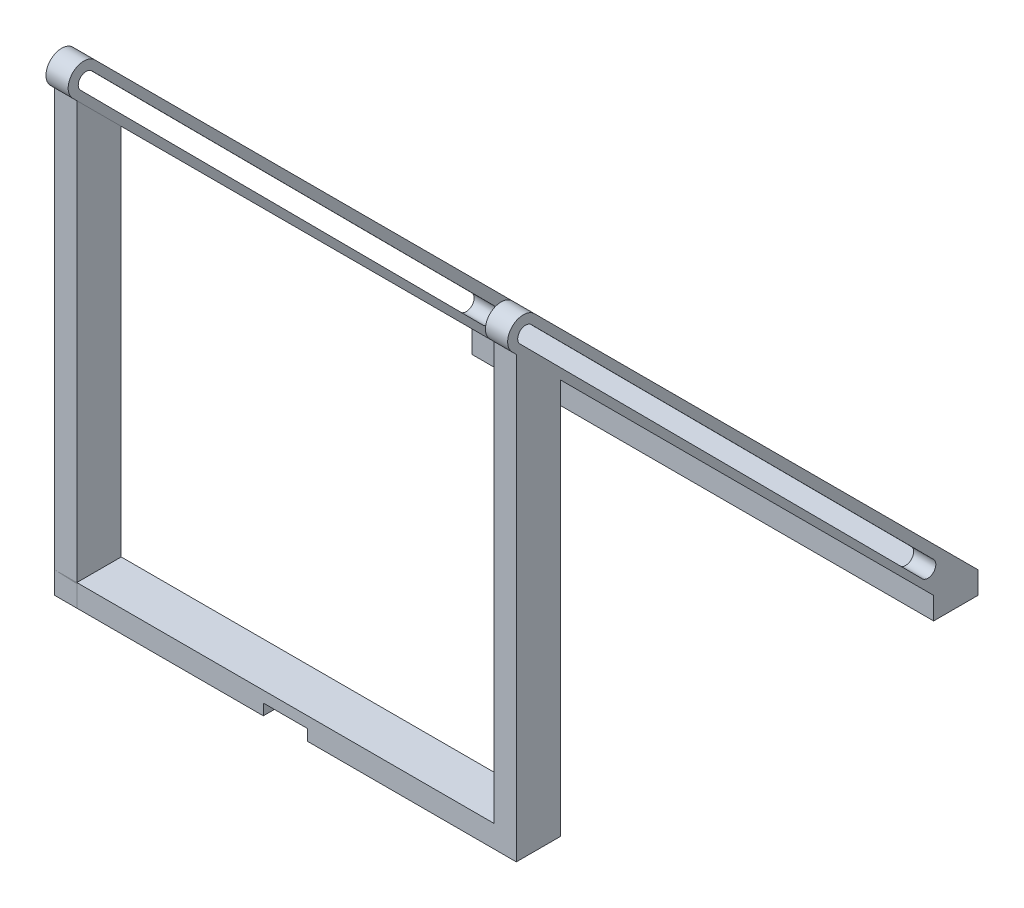
ISO-10303-21;
HEADER;
FILE_DESCRIPTION(('STEP AP214'),'2;1');
FILE_NAME('part.step','',(''),(''),'','','');
FILE_SCHEMA(('AUTOMOTIVE_DESIGN { 1 0 10303 214 1 1 1 1 }'));
ENDSEC;
DATA;
#1=APPLICATION_CONTEXT('core data for automotive mechanical design processes');
#2=APPLICATION_PROTOCOL_DEFINITION('international standard','automotive_design',2000,#1);
#3=PRODUCT_CONTEXT('',#1,'mechanical');
#4=PRODUCT('Part','Part','',(#3));
#5=PRODUCT_RELATED_PRODUCT_CATEGORY('part','',(#4));
#6=PRODUCT_DEFINITION_FORMATION('','',#4);
#7=PRODUCT_DEFINITION_CONTEXT('part definition',#1,'design');
#8=PRODUCT_DEFINITION('design','',#6,#7);
#9=PRODUCT_DEFINITION_SHAPE('','',#8);
#10=(LENGTH_UNIT() NAMED_UNIT(*) SI_UNIT(.MILLI.,.METRE.));
#11=(NAMED_UNIT(*) PLANE_ANGLE_UNIT() SI_UNIT($,.RADIAN.));
#12=(NAMED_UNIT(*) SI_UNIT($,.STERADIAN.) SOLID_ANGLE_UNIT());
#13=UNCERTAINTY_MEASURE_WITH_UNIT(LENGTH_MEASURE(1.E-05),#10,'distance_accuracy_value','');
#14=(GEOMETRIC_REPRESENTATION_CONTEXT(3) GLOBAL_UNCERTAINTY_ASSIGNED_CONTEXT((#13)) GLOBAL_UNIT_ASSIGNED_CONTEXT((#10,
#11,#12)) REPRESENTATION_CONTEXT('',''));
#15=CARTESIAN_POINT('',(0.,0.,0.));
#16=DIRECTION('',(0.,0.,1.));
#17=DIRECTION('',(1.,0.,0.));
#18=AXIS2_PLACEMENT_3D('',#15,#16,#17);
#19=CARTESIAN_POINT('',(-462.534,0.,462.534));
#20=DIRECTION('',(-1.,0.,0.));
#21=DIRECTION('',(0.,0.,1.));
#22=AXIS2_PLACEMENT_3D('',#19,#20,#21);
#23=PLANE('',#22);
#24=DIRECTION('',(0.,1.,0.));
#25=VECTOR('',#24,1.);
#26=CARTESIAN_POINT('',(-462.534,0.,462.534));
#27=LINE('',#26,#25);
#28=CARTESIAN_POINT('',(-462.534,0.,462.534));
#29=VERTEX_POINT('',#28);
#30=CARTESIAN_POINT('',(-462.534,880.618000000003,462.534));
#31=VERTEX_POINT('',#30);
#32=EDGE_CURVE('E49',#29,#31,#27,.T.);
#33=ORIENTED_EDGE('',*,*,#32,.T.);
#34=DIRECTION('',(0.,-0.707106781186549,-0.707106781186546));
#35=VECTOR('',#34,1.);
#36=CARTESIAN_POINT('',(-462.534,918.382115898591,500.298115898588));
#37=LINE('',#36,#35);
#38=CARTESIAN_POINT('',(-462.534,791.718000000003,373.634));
#39=VERTEX_POINT('',#38);
#40=EDGE_CURVE('E107',#31,#39,#37,.T.);
#41=ORIENTED_EDGE('',*,*,#40,.T.);
#42=DIRECTION('',(0.,1.,0.));
#43=VECTOR('',#42,1.);
#44=CARTESIAN_POINT('',(-462.534,0.,373.634));
#45=LINE('',#44,#43);
#46=CARTESIAN_POINT('',(-462.534,0.,373.634));
#47=VERTEX_POINT('',#46);
#48=EDGE_CURVE('E12',#47,#39,#45,.T.);
#49=ORIENTED_EDGE('',*,*,#48,.F.);
#50=DIRECTION('',(0.,0.,1.));
#51=VECTOR('',#50,1.);
#52=CARTESIAN_POINT('',(-462.534,0.,462.534));
#53=LINE('',#52,#51);
#54=EDGE_CURVE('E109',#47,#29,#53,.T.);
#55=ORIENTED_EDGE('',*,*,#54,.T.);
#56=EDGE_LOOP('',(#33,#41,#49,#55));
#57=FACE_BOUND('',#56,.T.);
#58=ADVANCED_FACE('F46',(#57),#23,.T.);
#59=CARTESIAN_POINT('',(-462.534,0.,373.634));
#60=DIRECTION('',(0.,0.,-1.));
#61=DIRECTION('',(-1.,0.,0.));
#62=AXIS2_PLACEMENT_3D('',#59,#60,#61);
#63=PLANE('',#62);
#64=ORIENTED_EDGE('',*,*,#48,.T.);
#65=DIRECTION('',(1.,0.,0.));
#66=VECTOR('',#65,1.);
#67=CARTESIAN_POINT('',(-462.534,791.718000000003,373.634));
#68=LINE('',#67,#66);
#69=CARTESIAN_POINT('',(-418.084,791.718000000003,373.634));
#70=VERTEX_POINT('',#69);
#71=EDGE_CURVE('E99',#39,#70,#68,.T.);
#72=ORIENTED_EDGE('',*,*,#71,.T.);
#73=DIRECTION('',(0.,1.,0.));
#74=VECTOR('',#73,1.);
#75=CARTESIAN_POINT('',(-418.084,0.,373.634));
#76=LINE('',#75,#74);
#77=CARTESIAN_POINT('',(-418.084,0.,373.634));
#78=VERTEX_POINT('',#77);
#79=EDGE_CURVE('E54',#78,#70,#76,.T.);
#80=ORIENTED_EDGE('',*,*,#79,.F.);
#81=DIRECTION('',(-1.,0.,0.));
#82=VECTOR('',#81,1.);
#83=CARTESIAN_POINT('',(-462.534,0.,373.634));
#84=LINE('',#83,#82);
#85=EDGE_CURVE('E115',#78,#47,#84,.T.);
#86=ORIENTED_EDGE('',*,*,#85,.T.);
#87=EDGE_LOOP('',(#64,#72,#80,#86));
#88=FACE_BOUND('',#87,.T.);
#89=ADVANCED_FACE('F103',(#88),#63,.T.);
#90=CARTESIAN_POINT('',(-418.084,0.,462.534));
#91=DIRECTION('',(1.,0.,0.));
#92=DIRECTION('',(0.,0.,-1.));
#93=AXIS2_PLACEMENT_3D('',#90,#91,#92);
#94=PLANE('',#93);
#95=ORIENTED_EDGE('',*,*,#79,.T.);
#96=DIRECTION('',(0.,0.707106781186549,0.707106781186546));
#97=VECTOR('',#96,1.);
#98=CARTESIAN_POINT('',(-418.084,918.382115898591,500.298115898588));
#99=LINE('',#98,#97);
#100=CARTESIAN_POINT('',(-418.084,880.618000000003,462.534));
#101=VERTEX_POINT('',#100);
#102=EDGE_CURVE('E88',#70,#101,#99,.T.);
#103=ORIENTED_EDGE('',*,*,#102,.T.);
#104=DIRECTION('',(0.,1.,0.));
#105=VECTOR('',#104,1.);
#106=CARTESIAN_POINT('',(-418.084,0.,462.534));
#107=LINE('',#106,#105);
#108=CARTESIAN_POINT('',(-418.084,0.,462.534));
#109=VERTEX_POINT('',#108);
#110=EDGE_CURVE('E92',#109,#101,#107,.T.);
#111=ORIENTED_EDGE('',*,*,#110,.F.);
#112=DIRECTION('',(0.,0.,-1.));
#113=VECTOR('',#112,1.);
#114=CARTESIAN_POINT('',(-418.084,0.,462.534));
#115=LINE('',#114,#113);
#116=EDGE_CURVE('E90',#109,#78,#115,.T.);
#117=ORIENTED_EDGE('',*,*,#116,.T.);
#118=EDGE_LOOP('',(#95,#103,#111,#117));
#119=FACE_BOUND('',#118,.T.);
#120=ADVANCED_FACE('F87',(#119),#94,.T.);
#121=CARTESIAN_POINT('',(-462.534,0.,462.534));
#122=DIRECTION('',(0.,0.,1.));
#123=DIRECTION('',(1.,0.,0.));
#124=AXIS2_PLACEMENT_3D('',#121,#122,#123);
#125=PLANE('',#124);
#126=ORIENTED_EDGE('',*,*,#110,.T.);
#127=DIRECTION('',(-1.,0.,0.));
#128=VECTOR('',#127,1.);
#129=CARTESIAN_POINT('',(-462.534,880.618000000003,462.534));
#130=LINE('',#129,#128);
#131=EDGE_CURVE('E101',#101,#31,#130,.T.);
#132=ORIENTED_EDGE('',*,*,#131,.T.);
#133=ORIENTED_EDGE('',*,*,#32,.F.);
#134=DIRECTION('',(1.,0.,0.));
#135=VECTOR('',#134,1.);
#136=CARTESIAN_POINT('',(-462.534,0.,462.534));
#137=LINE('',#136,#135);
#138=EDGE_CURVE('E111',#29,#109,#137,.T.);
#139=ORIENTED_EDGE('',*,*,#138,.T.);
#140=EDGE_LOOP('',(#126,#132,#133,#139));
#141=FACE_BOUND('',#140,.T.);
#142=ADVANCED_FACE('F118',(#141),#125,.T.);
#143=CARTESIAN_POINT('',(0.,0.,0.));
#144=DIRECTION('',(0.,-1.,0.));
#145=DIRECTION('',(0.,0.,-1.));
#146=AXIS2_PLACEMENT_3D('',#143,#144,#145);
#147=PLANE('',#146);
#148=ORIENTED_EDGE('',*,*,#54,.F.);
#149=ORIENTED_EDGE('',*,*,#85,.F.);
#150=ORIENTED_EDGE('',*,*,#116,.F.);
#151=ORIENTED_EDGE('',*,*,#138,.F.);
#152=EDGE_LOOP('',(#148,#149,#150,#151));
#153=FACE_BOUND('',#152,.T.);
#154=ADVANCED_FACE('F120',(#153),#147,.T.);
#155=CARTESIAN_POINT('',(-462.534,44.45,-373.634));
#156=DIRECTION('',(0.,-0.707106781186546,0.707106781186549));
#157=DIRECTION('',(0.,-0.707106781186549,-0.707106781186546));
#158=AXIS2_PLACEMENT_3D('',#155,#156,#157);
#159=PLANE('',#158);
#160=ORIENTED_EDGE('',*,*,#131,.F.);
#161=ORIENTED_EDGE('',*,*,#102,.F.);
#162=ORIENTED_EDGE('',*,*,#71,.F.);
#163=ORIENTED_EDGE('',*,*,#40,.F.);
#164=EDGE_LOOP('',(#160,#161,#162,#163));
#165=FACE_BOUND('',#164,.T.);
#166=ADVANCED_FACE('F97',(#165),#159,.F.);
#167=CLOSED_SHELL('',(#58,#89,#120,#142,#154,#166));
#168=MANIFOLD_SOLID_BREP('B2',#167);
#169=CARTESIAN_POINT('',(-418.084,911.044715683175,448.510715683172));
#170=DIRECTION('',(1.,0.,0.));
#171=DIRECTION('',(0.,0.,-1.));
#172=AXIS2_PLACEMENT_3D('',#169,#170,#171);
#173=CYLINDRICAL_SURFACE('',#172,31.4308964237421);
#174=DIRECTION('',(1.,0.,0.));
#175=VECTOR('',#174,1.);
#176=CARTESIAN_POINT('',(-462.534,888.819715683175,470.735715683172));
#177=LINE('',#176,#175);
#178=CARTESIAN_POINT('',(-418.084,888.819715683175,470.735715683172));
#179=VERTEX_POINT('',#178);
#180=CARTESIAN_POINT('',(-462.534,888.819715683175,470.735715683172));
#181=VERTEX_POINT('',#180);
#182=EDGE_CURVE('E301',#179,#181,#177,.F.);
#183=ORIENTED_EDGE('',*,*,#182,.F.);
#184=CARTESIAN_POINT('',(-418.084,911.044715683175,448.510715683172));
#185=DIRECTION('',(1.,0.,0.));
#186=DIRECTION('',(0.,0.,-1.));
#187=AXIS2_PLACEMENT_3D('',#184,#185,#186);
#188=CIRCLE('',#187,31.4308964237421);
#189=CARTESIAN_POINT('',(-418.084,933.269715683175,426.285715683172));
#190=VERTEX_POINT('',#189);
#191=EDGE_CURVE('E187',#190,#179,#188,.T.);
#192=ORIENTED_EDGE('',*,*,#191,.F.);
#193=DIRECTION('',(1.,0.,0.));
#194=VECTOR('',#193,1.);
#195=CARTESIAN_POINT('',(-462.534,933.269715683175,426.285715683172));
#196=LINE('',#195,#194);
#197=CARTESIAN_POINT('',(-462.534,933.269715683175,426.285715683172));
#198=VERTEX_POINT('',#197);
#199=EDGE_CURVE('E306',#198,#190,#196,.T.);
#200=ORIENTED_EDGE('',*,*,#199,.F.);
#201=CARTESIAN_POINT('',(-462.534,911.044715683175,448.510715683172));
#202=DIRECTION('',(-1.,0.,0.));
#203=DIRECTION('',(0.,0.,1.));
#204=AXIS2_PLACEMENT_3D('',#201,#202,#203);
#205=CIRCLE('',#204,31.4308964237421);
#206=EDGE_CURVE('E44',#181,#198,#205,.T.);
#207=ORIENTED_EDGE('',*,*,#206,.F.);
#208=EDGE_LOOP('',(#183,#192,#200,#207));
#209=FACE_BOUND('',#208,.T.);
#210=ADVANCED_FACE('F179',(#209),#173,.T.);
#211=CARTESIAN_POINT('',(0.,44.45,0.));
#212=DIRECTION('',(0.,1.,0.));
#213=DIRECTION('',(0.,0.,1.));
#214=AXIS2_PLACEMENT_3D('',#211,#212,#213);
#215=PLANE('',#214);
#216=DIRECTION('',(0.,0.,1.));
#217=VECTOR('',#216,1.);
#218=CARTESIAN_POINT('',(-462.534,44.45,-462.534));
#219=LINE('',#218,#217);
#220=CARTESIAN_POINT('',(-462.534,44.45,-462.534));
#221=VERTEX_POINT('',#220);
#222=CARTESIAN_POINT('',(-462.534,44.45,-373.634));
#223=VERTEX_POINT('',#222);
#224=EDGE_CURVE('E276',#221,#223,#219,.T.);
#225=ORIENTED_EDGE('',*,*,#224,.F.);
#226=DIRECTION('',(-1.,0.,0.));
#227=VECTOR('',#226,1.);
#228=CARTESIAN_POINT('',(-462.534,44.45,-462.534));
#229=LINE('',#228,#227);
#230=CARTESIAN_POINT('',(-418.084,44.45,-462.534));
#231=VERTEX_POINT('',#230);
#232=EDGE_CURVE('E290',#231,#221,#229,.T.);
#233=ORIENTED_EDGE('',*,*,#232,.F.);
#234=DIRECTION('',(0.,0.,-1.));
#235=VECTOR('',#234,1.);
#236=CARTESIAN_POINT('',(-418.084,44.45,-462.534));
#237=LINE('',#236,#235);
#238=CARTESIAN_POINT('',(-418.084,44.45,-373.634));
#239=VERTEX_POINT('',#238);
#240=EDGE_CURVE('E293',#239,#231,#237,.T.);
#241=ORIENTED_EDGE('',*,*,#240,.F.);
#242=DIRECTION('',(1.,0.,0.));
#243=VECTOR('',#242,1.);
#244=CARTESIAN_POINT('',(-462.534,44.45,-373.634));
#245=LINE('',#244,#243);
#246=EDGE_CURVE('E282',#223,#239,#245,.T.);
#247=ORIENTED_EDGE('',*,*,#246,.F.);
#248=EDGE_LOOP('',(#225,#233,#241,#247));
#249=FACE_BOUND('',#248,.T.);
#250=ADVANCED_FACE('F317',(#249),#215,.F.);
#251=CARTESIAN_POINT('',(-462.534,44.45,-462.534));
#252=DIRECTION('',(-1.,0.,0.));
#253=DIRECTION('',(0.,0.,1.));
#254=AXIS2_PLACEMENT_3D('',#251,#252,#253);
#255=PLANE('',#254);
#256=CARTESIAN_POINT('',(-462.534,95.810254037124,-362.12613366491));
#257=DIRECTION('',(-1.,0.,0.));
#258=DIRECTION('',(0.,0.,1.));
#259=AXIS2_PLACEMENT_3D('',#256,#257,#258);
#260=CIRCLE('',#259,15.875);
#261=CARTESIAN_POINT('',(-462.534,107.004633732663,-373.382309224668));
#262=VERTEX_POINT('',#261);
#263=CARTESIAN_POINT('',(-462.534,84.6158743415852,-350.869958105151));
#264=VERTEX_POINT('',#263);
#265=EDGE_CURVE('E194',#262,#264,#260,.T.);
#266=ORIENTED_EDGE('',*,*,#265,.F.);
#267=DIRECTION('',(0.,-0.709050428961181,-0.705157776096928));
#268=VECTOR('',#267,1.);
#269=CARTESIAN_POINT('',(-462.534,107.004633732663,-373.382309224668));
#270=LINE('',#269,#268);
#271=CARTESIAN_POINT('',(-462.534,917.449274035293,432.61302885412));
#272=VERTEX_POINT('',#271);
#273=EDGE_CURVE('E261',#272,#262,#270,.T.);
#274=ORIENTED_EDGE('',*,*,#273,.F.);
#275=CARTESIAN_POINT('',(-462.534,906.254894339754,443.869204413879));
#276=DIRECTION('',(-1.,0.,0.));
#277=DIRECTION('',(0.,0.,1.));
#278=AXIS2_PLACEMENT_3D('',#275,#276,#277);
#279=CIRCLE('',#278,15.8749999999995);
#280=CARTESIAN_POINT('',(-462.534,895.060514644216,455.125379973637));
#281=VERTEX_POINT('',#280);
#282=EDGE_CURVE('E264',#281,#272,#279,.T.);
#283=ORIENTED_EDGE('',*,*,#282,.F.);
#284=DIRECTION('',(0.,0.709050428961182,0.705157776096928));
#285=VECTOR('',#284,1.);
#286=CARTESIAN_POINT('',(-462.534,84.6158743415853,-350.869958105151));
#287=LINE('',#286,#285);
#288=EDGE_CURVE('E270',#264,#281,#287,.T.);
#289=ORIENTED_EDGE('',*,*,#288,.F.);
#290=EDGE_LOOP('',(#266,#274,#283,#289));
#291=FACE_BOUND('',#290,.T.);
#292=DIRECTION('',(0.,0.707106781186549,0.707106781186546));
#293=VECTOR('',#292,1.);
#294=CARTESIAN_POINT('',(-462.534,44.45,-373.634));
#295=LINE('',#294,#293);
#296=EDGE_CURVE('E283',#223,#181,#295,.T.);
#297=ORIENTED_EDGE('',*,*,#296,.T.);
#298=ORIENTED_EDGE('',*,*,#206,.T.);
#299=DIRECTION('',(0.,0.707106781186549,0.707106781186546));
#300=VECTOR('',#299,1.);
#301=CARTESIAN_POINT('',(-462.534,44.45,-462.534));
#302=LINE('',#301,#300);
#303=EDGE_CURVE('E287',#221,#198,#302,.T.);
#304=ORIENTED_EDGE('',*,*,#303,.F.);
#305=ORIENTED_EDGE('',*,*,#224,.T.);
#306=EDGE_LOOP('',(#297,#298,#304,#305));
#307=FACE_BOUND('',#306,.T.);
#308=ADVANCED_FACE('F320',(#291,#307),#255,.T.);
#309=CARTESIAN_POINT('',(-462.534,44.45,-373.634));
#310=DIRECTION('',(0.,-0.707106781186546,0.707106781186549));
#311=DIRECTION('',(0.,-0.707106781186549,-0.707106781186546));
#312=AXIS2_PLACEMENT_3D('',#309,#310,#311);
#313=PLANE('',#312);
#314=DIRECTION('',(0.,0.707106781186549,0.707106781186546));
#315=VECTOR('',#314,1.);
#316=CARTESIAN_POINT('',(-418.084,44.45,-373.634));
#317=LINE('',#316,#315);
#318=EDGE_CURVE('E286',#239,#179,#317,.T.);
#319=ORIENTED_EDGE('',*,*,#318,.T.);
#320=ORIENTED_EDGE('',*,*,#182,.T.);
#321=ORIENTED_EDGE('',*,*,#296,.F.);
#322=ORIENTED_EDGE('',*,*,#246,.T.);
#323=EDGE_LOOP('',(#319,#320,#321,#322));
#324=FACE_BOUND('',#323,.T.);
#325=ADVANCED_FACE('F315',(#324),#313,.T.);
#326=CARTESIAN_POINT('',(-418.084,44.45,-462.534));
#327=DIRECTION('',(1.,0.,0.));
#328=DIRECTION('',(0.,0.,-1.));
#329=AXIS2_PLACEMENT_3D('',#326,#327,#328);
#330=PLANE('',#329);
#331=CARTESIAN_POINT('',(-418.084,95.810254037124,-362.12613366491));
#332=DIRECTION('',(-1.,0.,0.));
#333=DIRECTION('',(0.,0.,1.));
#334=AXIS2_PLACEMENT_3D('',#331,#332,#333);
#335=CIRCLE('',#334,15.875);
#336=CARTESIAN_POINT('',(-418.084,107.004633732663,-373.382309224668));
#337=VERTEX_POINT('',#336);
#338=CARTESIAN_POINT('',(-418.084,84.6158743415853,-350.869958105151));
#339=VERTEX_POINT('',#338);
#340=EDGE_CURVE('E245',#337,#339,#335,.T.);
#341=ORIENTED_EDGE('',*,*,#340,.T.);
#342=DIRECTION('',(0.,0.709050428961182,0.705157776096928));
#343=VECTOR('',#342,1.);
#344=CARTESIAN_POINT('',(-418.084,84.6158743415853,-350.869958105151));
#345=LINE('',#344,#343);
#346=CARTESIAN_POINT('',(-418.084,895.060514644216,455.125379973637));
#347=VERTEX_POINT('',#346);
#348=EDGE_CURVE('E254',#339,#347,#345,.T.);
#349=ORIENTED_EDGE('',*,*,#348,.T.);
#350=CARTESIAN_POINT('',(-418.084,906.254894339754,443.869204413879));
#351=DIRECTION('',(-1.,0.,0.));
#352=DIRECTION('',(0.,0.,1.));
#353=AXIS2_PLACEMENT_3D('',#350,#351,#352);
#354=CIRCLE('',#353,15.8749999999995);
#355=CARTESIAN_POINT('',(-418.084,917.449274035293,432.61302885412));
#356=VERTEX_POINT('',#355);
#357=EDGE_CURVE('E202',#347,#356,#354,.T.);
#358=ORIENTED_EDGE('',*,*,#357,.T.);
#359=DIRECTION('',(0.,-0.709050428961181,-0.705157776096928));
#360=VECTOR('',#359,1.);
#361=CARTESIAN_POINT('',(-418.084,107.004633732663,-373.382309224668));
#362=LINE('',#361,#360);
#363=EDGE_CURVE('E251',#356,#337,#362,.T.);
#364=ORIENTED_EDGE('',*,*,#363,.T.);
#365=EDGE_LOOP('',(#341,#349,#358,#364));
#366=FACE_BOUND('',#365,.T.);
#367=DIRECTION('',(0.,0.707106781186549,0.707106781186546));
#368=VECTOR('',#367,1.);
#369=CARTESIAN_POINT('',(-418.084,44.45,-462.534));
#370=LINE('',#369,#368);
#371=EDGE_CURVE('E296',#231,#190,#370,.T.);
#372=ORIENTED_EDGE('',*,*,#371,.T.);
#373=ORIENTED_EDGE('',*,*,#191,.T.);
#374=ORIENTED_EDGE('',*,*,#318,.F.);
#375=ORIENTED_EDGE('',*,*,#240,.T.);
#376=EDGE_LOOP('',(#372,#373,#374,#375));
#377=FACE_BOUND('',#376,.T.);
#378=ADVANCED_FACE('F258',(#366,#377),#330,.T.);
#379=CARTESIAN_POINT('',(-462.534,44.45,-462.534));
#380=DIRECTION('',(0.,0.707106781186546,-0.707106781186549));
#381=DIRECTION('',(0.,0.707106781186549,0.707106781186546));
#382=AXIS2_PLACEMENT_3D('',#379,#380,#381);
#383=PLANE('',#382);
#384=ORIENTED_EDGE('',*,*,#303,.T.);
#385=ORIENTED_EDGE('',*,*,#199,.T.);
#386=ORIENTED_EDGE('',*,*,#371,.F.);
#387=ORIENTED_EDGE('',*,*,#232,.T.);
#388=EDGE_LOOP('',(#384,#385,#386,#387));
#389=FACE_BOUND('',#388,.T.);
#390=ADVANCED_FACE('F322',(#389),#383,.T.);
#391=CARTESIAN_POINT('',(-418.084,95.810254037124,-362.12613366491));
#392=DIRECTION('',(-1.,0.,0.));
#393=DIRECTION('',(0.,0.,1.));
#394=AXIS2_PLACEMENT_3D('',#391,#392,#393);
#395=CYLINDRICAL_SURFACE('',#394,15.875);
#396=ORIENTED_EDGE('',*,*,#265,.T.);
#397=DIRECTION('',(-1.,0.,0.));
#398=VECTOR('',#397,1.);
#399=CARTESIAN_POINT('',(-418.084,84.6158743415853,-350.869958105151));
#400=LINE('',#399,#398);
#401=EDGE_CURVE('E241',#339,#264,#400,.T.);
#402=ORIENTED_EDGE('',*,*,#401,.F.);
#403=ORIENTED_EDGE('',*,*,#340,.F.);
#404=DIRECTION('',(-1.,0.,0.));
#405=VECTOR('',#404,1.);
#406=CARTESIAN_POINT('',(-418.084,107.004633732663,-373.382309224668));
#407=LINE('',#406,#405);
#408=EDGE_CURVE('E274',#337,#262,#407,.T.);
#409=ORIENTED_EDGE('',*,*,#408,.T.);
#410=EDGE_LOOP('',(#396,#402,#403,#409));
#411=FACE_BOUND('',#410,.T.);
#412=ADVANCED_FACE('F243',(#411),#395,.F.);
#413=CARTESIAN_POINT('',(-418.084,107.004633732663,-373.382309224668));
#414=DIRECTION('',(0.,0.705157776096928,-0.709050428961181));
#415=DIRECTION('',(0.,0.709050428961181,0.705157776096928));
#416=AXIS2_PLACEMENT_3D('',#413,#414,#415);
#417=PLANE('',#416);
#418=ORIENTED_EDGE('',*,*,#273,.T.);
#419=ORIENTED_EDGE('',*,*,#408,.F.);
#420=ORIENTED_EDGE('',*,*,#363,.F.);
#421=DIRECTION('',(-1.,0.,0.));
#422=VECTOR('',#421,1.);
#423=CARTESIAN_POINT('',(-418.084,917.449274035293,432.61302885412));
#424=LINE('',#423,#422);
#425=EDGE_CURVE('E277',#356,#272,#424,.T.);
#426=ORIENTED_EDGE('',*,*,#425,.T.);
#427=EDGE_LOOP('',(#418,#419,#420,#426));
#428=FACE_BOUND('',#427,.T.);
#429=ADVANCED_FACE('F329',(#428),#417,.F.);
#430=CARTESIAN_POINT('',(-418.084,906.254894339754,443.869204413879));
#431=DIRECTION('',(-1.,0.,0.));
#432=DIRECTION('',(0.,0.,1.));
#433=AXIS2_PLACEMENT_3D('',#430,#431,#432);
#434=CYLINDRICAL_SURFACE('',#433,15.8749999999995);
#435=ORIENTED_EDGE('',*,*,#282,.T.);
#436=ORIENTED_EDGE('',*,*,#425,.F.);
#437=ORIENTED_EDGE('',*,*,#357,.F.);
#438=DIRECTION('',(-1.,0.,0.));
#439=VECTOR('',#438,1.);
#440=CARTESIAN_POINT('',(-418.084,895.060514644216,455.125379973637));
#441=LINE('',#440,#439);
#442=EDGE_CURVE('E250',#347,#281,#441,.T.);
#443=ORIENTED_EDGE('',*,*,#442,.T.);
#444=EDGE_LOOP('',(#435,#436,#437,#443));
#445=FACE_BOUND('',#444,.T.);
#446=ADVANCED_FACE('F348',(#445),#434,.F.);
#447=CARTESIAN_POINT('',(-418.084,84.6158743415853,-350.869958105151));
#448=DIRECTION('',(0.,-0.705157776096927,0.709050428961182));
#449=DIRECTION('',(0.,-0.709050428961182,-0.705157776096927));
#450=AXIS2_PLACEMENT_3D('',#447,#448,#449);
#451=PLANE('',#450);
#452=ORIENTED_EDGE('',*,*,#288,.T.);
#453=ORIENTED_EDGE('',*,*,#442,.F.);
#454=ORIENTED_EDGE('',*,*,#348,.F.);
#455=ORIENTED_EDGE('',*,*,#401,.T.);
#456=EDGE_LOOP('',(#452,#453,#454,#455));
#457=FACE_BOUND('',#456,.T.);
#458=ADVANCED_FACE('F255',(#457),#451,.F.);
#459=CLOSED_SHELL('',(#210,#250,#308,#325,#378,#390,#412,#429,#446,#458));
#460=MANIFOLD_SOLID_BREP('B6',#459);
#461=CARTESIAN_POINT('',(-462.534,44.45,462.534));
#462=DIRECTION('',(0.,0.,-1.));
#463=DIRECTION('',(-1.,0.,0.));
#464=AXIS2_PLACEMENT_3D('',#461,#462,#463);
#465=PLANE('',#464);
#466=DIRECTION('',(0.,1.,0.));
#467=VECTOR('',#466,1.);
#468=CARTESIAN_POINT('',(44.4499999999999,44.45,462.534));
#469=LINE('',#468,#467);
#470=CARTESIAN_POINT('',(44.45,0.,462.534));
#471=VERTEX_POINT('',#470);
#472=CARTESIAN_POINT('',(44.45,22.225,462.534));
#473=VERTEX_POINT('',#472);
#474=EDGE_CURVE('E740',#471,#473,#469,.T.);
#475=ORIENTED_EDGE('',*,*,#474,.F.);
#476=DIRECTION('',(1.,0.,0.));
#477=VECTOR('',#476,1.);
#478=CARTESIAN_POINT('',(-462.534,0.,462.534));
#479=LINE('',#478,#477);
#480=CARTESIAN_POINT('',(462.534,0.,462.534));
#481=VERTEX_POINT('',#480);
#482=EDGE_CURVE('E693',#471,#481,#479,.T.);
#483=ORIENTED_EDGE('',*,*,#482,.T.);
#484=DIRECTION('',(0.,-1.,0.));
#485=VECTOR('',#484,1.);
#486=CARTESIAN_POINT('',(462.534,44.45,462.534));
#487=LINE('',#486,#485);
#488=CARTESIAN_POINT('',(462.534,880.618000000003,462.534));
#489=VERTEX_POINT('',#488);
#490=EDGE_CURVE('E591',#489,#481,#487,.T.);
#491=ORIENTED_EDGE('',*,*,#490,.F.);
#492=DIRECTION('',(1.,0.,0.));
#493=VECTOR('',#492,1.);
#494=CARTESIAN_POINT('',(462.534,880.618000000003,462.534));
#495=LINE('',#494,#493);
#496=CARTESIAN_POINT('',(418.084,880.618000000003,462.534));
#497=VERTEX_POINT('',#496);
#498=EDGE_CURVE('E708',#497,#489,#495,.T.);
#499=ORIENTED_EDGE('',*,*,#498,.F.);
#500=DIRECTION('',(0.,1.,0.));
#501=VECTOR('',#500,1.);
#502=CARTESIAN_POINT('',(418.084,0.,462.534));
#503=LINE('',#502,#501);
#504=CARTESIAN_POINT('',(418.084,44.45,462.534));
#505=VERTEX_POINT('',#504);
#506=EDGE_CURVE('E435',#505,#497,#503,.T.);
#507=ORIENTED_EDGE('',*,*,#506,.F.);
#508=DIRECTION('',(1.,0.,0.));
#509=VECTOR('',#508,1.);
#510=CARTESIAN_POINT('',(-462.534,44.45,462.534));
#511=LINE('',#510,#509);
#512=CARTESIAN_POINT('',(-462.534,44.45,462.534));
#513=VERTEX_POINT('',#512);
#514=EDGE_CURVE('E722',#513,#505,#511,.T.);
#515=ORIENTED_EDGE('',*,*,#514,.F.);
#516=DIRECTION('',(0.,-1.,0.));
#517=VECTOR('',#516,1.);
#518=CARTESIAN_POINT('',(-462.534,44.45,462.534));
#519=LINE('',#518,#517);
#520=CARTESIAN_POINT('',(-462.534,0.,462.534));
#521=VERTEX_POINT('',#520);
#522=EDGE_CURVE('E594',#513,#521,#519,.T.);
#523=ORIENTED_EDGE('',*,*,#522,.T.);
#524=CARTESIAN_POINT('',(-44.45,0.,462.534));
#525=VERTEX_POINT('',#524);
#526=EDGE_CURVE('E581',#521,#525,#479,.T.);
#527=ORIENTED_EDGE('',*,*,#526,.T.);
#528=DIRECTION('',(0.,1.,0.));
#529=VECTOR('',#528,1.);
#530=CARTESIAN_POINT('',(-44.45,44.45,462.534));
#531=LINE('',#530,#529);
#532=CARTESIAN_POINT('',(-44.45,22.225,462.534));
#533=VERTEX_POINT('',#532);
#534=EDGE_CURVE('E427',#525,#533,#531,.T.);
#535=ORIENTED_EDGE('',*,*,#534,.T.);
#536=DIRECTION('',(1.,0.,0.));
#537=VECTOR('',#536,1.);
#538=CARTESIAN_POINT('',(-462.534,22.225,462.534));
#539=LINE('',#538,#537);
#540=EDGE_CURVE('E736',#533,#473,#539,.T.);
#541=ORIENTED_EDGE('',*,*,#540,.T.);
#542=EDGE_LOOP('',(#475,#483,#491,#499,#507,#515,#523,#527,#535,#541));
#543=FACE_BOUND('',#542,.T.);
#544=ADVANCED_FACE('F412',(#543),#465,.F.);
#545=CARTESIAN_POINT('',(-462.534,44.45,373.634));
#546=DIRECTION('',(0.,0.,1.));
#547=DIRECTION('',(1.,0.,0.));
#548=AXIS2_PLACEMENT_3D('',#545,#546,#547);
#549=PLANE('',#548);
#550=DIRECTION('',(0.,-1.,0.));
#551=VECTOR('',#550,1.);
#552=CARTESIAN_POINT('',(44.4499999999999,44.45,373.634));
#553=LINE('',#552,#551);
#554=CARTESIAN_POINT('',(44.45,22.225,373.634));
#555=VERTEX_POINT('',#554);
#556=CARTESIAN_POINT('',(44.45,0.,373.634));
#557=VERTEX_POINT('',#556);
#558=EDGE_CURVE('E696',#555,#557,#553,.T.);
#559=ORIENTED_EDGE('',*,*,#558,.F.);
#560=DIRECTION('',(-1.,0.,0.));
#561=VECTOR('',#560,1.);
#562=CARTESIAN_POINT('',(-462.534,22.225,373.634));
#563=LINE('',#562,#561);
#564=CARTESIAN_POINT('',(-44.45,22.225,373.634));
#565=VERTEX_POINT('',#564);
#566=EDGE_CURVE('E177',#555,#565,#563,.T.);
#567=ORIENTED_EDGE('',*,*,#566,.T.);
#568=DIRECTION('',(0.,-1.,0.));
#569=VECTOR('',#568,1.);
#570=CARTESIAN_POINT('',(-44.45,44.45,373.634));
#571=LINE('',#570,#569);
#572=CARTESIAN_POINT('',(-44.45,0.,373.634));
#573=VERTEX_POINT('',#572);
#574=EDGE_CURVE('E557',#565,#573,#571,.T.);
#575=ORIENTED_EDGE('',*,*,#574,.T.);
#576=DIRECTION('',(-1.,0.,0.));
#577=VECTOR('',#576,1.);
#578=CARTESIAN_POINT('',(-462.534,0.,373.634));
#579=LINE('',#578,#577);
#580=CARTESIAN_POINT('',(-462.534,0.,373.634));
#581=VERTEX_POINT('',#580);
#582=EDGE_CURVE('E568',#573,#581,#579,.T.);
#583=ORIENTED_EDGE('',*,*,#582,.T.);
#584=DIRECTION('',(0.,-1.,0.));
#585=VECTOR('',#584,1.);
#586=CARTESIAN_POINT('',(-462.534,44.45,373.634));
#587=LINE('',#586,#585);
#588=CARTESIAN_POINT('',(-462.534,44.45,373.634));
#589=VERTEX_POINT('',#588);
#590=EDGE_CURVE('E585',#589,#581,#587,.T.);
#591=ORIENTED_EDGE('',*,*,#590,.F.);
#592=DIRECTION('',(-1.,0.,0.));
#593=VECTOR('',#592,1.);
#594=CARTESIAN_POINT('',(-462.534,44.45,373.634));
#595=LINE('',#594,#593);
#596=CARTESIAN_POINT('',(418.084,44.45,373.634));
#597=VERTEX_POINT('',#596);
#598=EDGE_CURVE('E588',#597,#589,#595,.T.);
#599=ORIENTED_EDGE('',*,*,#598,.F.);
#600=DIRECTION('',(0.,1.,0.));
#601=VECTOR('',#600,1.);
#602=CARTESIAN_POINT('',(418.084,0.,373.634));
#603=LINE('',#602,#601);
#604=CARTESIAN_POINT('',(418.084,791.718000000003,373.634));
#605=VERTEX_POINT('',#604);
#606=EDGE_CURVE('E716',#597,#605,#603,.T.);
#607=ORIENTED_EDGE('',*,*,#606,.T.);
#608=DIRECTION('',(-1.,0.,0.));
#609=VECTOR('',#608,1.);
#610=CARTESIAN_POINT('',(462.534,791.718000000003,373.634));
#611=LINE('',#610,#609);
#612=CARTESIAN_POINT('',(462.534,791.718000000003,373.634));
#613=VERTEX_POINT('',#612);
#614=EDGE_CURVE('E699',#613,#605,#611,.T.);
#615=ORIENTED_EDGE('',*,*,#614,.F.);
#616=DIRECTION('',(0.,-1.,0.));
#617=VECTOR('',#616,1.);
#618=CARTESIAN_POINT('',(462.534,44.45,373.634));
#619=LINE('',#618,#617);
#620=CARTESIAN_POINT('',(462.534,0.,373.634));
#621=VERTEX_POINT('',#620);
#622=EDGE_CURVE('E587',#613,#621,#619,.T.);
#623=ORIENTED_EDGE('',*,*,#622,.T.);
#624=EDGE_CURVE('E576',#621,#557,#579,.T.);
#625=ORIENTED_EDGE('',*,*,#624,.T.);
#626=EDGE_LOOP('',(#559,#567,#575,#583,#591,#599,#607,#615,#623,#625));
#627=FACE_BOUND('',#626,.T.);
#628=ADVANCED_FACE('F566',(#627),#549,.F.);
#629=CARTESIAN_POINT('',(0.,0.,0.));
#630=DIRECTION('',(0.,-1.,0.));
#631=DIRECTION('',(0.,0.,-1.));
#632=AXIS2_PLACEMENT_3D('',#629,#630,#631);
#633=PLANE('',#632);
#634=ORIENTED_EDGE('',*,*,#482,.F.);
#635=DIRECTION('',(0.,0.,-1.));
#636=VECTOR('',#635,1.);
#637=CARTESIAN_POINT('',(44.45,0.,0.));
#638=LINE('',#637,#636);
#639=EDGE_CURVE('E420',#471,#557,#638,.T.);
#640=ORIENTED_EDGE('',*,*,#639,.T.);
#641=ORIENTED_EDGE('',*,*,#624,.F.);
#642=DIRECTION('',(0.,0.,-1.));
#643=VECTOR('',#642,1.);
#644=CARTESIAN_POINT('',(462.534,0.,462.534));
#645=LINE('',#644,#643);
#646=EDGE_CURVE('E577',#481,#621,#645,.T.);
#647=ORIENTED_EDGE('',*,*,#646,.F.);
#648=EDGE_LOOP('',(#634,#640,#641,#647));
#649=FACE_BOUND('',#648,.T.);
#650=ADVANCED_FACE('F691',(#649),#633,.T.);
#651=CARTESIAN_POINT('',(462.534,44.45,-373.634));
#652=DIRECTION('',(0.,-0.707106781186546,0.707106781186549));
#653=DIRECTION('',(0.,-0.707106781186549,-0.707106781186546));
#654=AXIS2_PLACEMENT_3D('',#651,#652,#653);
#655=PLANE('',#654);
#656=DIRECTION('',(0.,0.707106781186549,0.707106781186546));
#657=VECTOR('',#656,1.);
#658=CARTESIAN_POINT('',(418.084,44.45,-373.634));
#659=LINE('',#658,#657);
#660=CARTESIAN_POINT('',(418.084,888.819715683175,470.735715683172));
#661=VERTEX_POINT('',#660);
#662=EDGE_CURVE('E633',#497,#661,#659,.T.);
#663=ORIENTED_EDGE('',*,*,#662,.F.);
#664=ORIENTED_EDGE('',*,*,#498,.T.);
#665=DIRECTION('',(0.,0.707106781186549,0.707106781186546));
#666=VECTOR('',#665,1.);
#667=CARTESIAN_POINT('',(462.534,44.45,-373.634));
#668=LINE('',#667,#666);
#669=CARTESIAN_POINT('',(462.534,888.819715683175,470.735715683172));
#670=VERTEX_POINT('',#669);
#671=EDGE_CURVE('E627',#489,#670,#668,.T.);
#672=ORIENTED_EDGE('',*,*,#671,.T.);
#673=DIRECTION('',(-1.,0.,0.));
#674=VECTOR('',#673,1.);
#675=CARTESIAN_POINT('',(462.534,888.819715683175,470.735715683172));
#676=LINE('',#675,#674);
#677=EDGE_CURVE('E597',#661,#670,#676,.F.);
#678=ORIENTED_EDGE('',*,*,#677,.F.);
#679=EDGE_LOOP('',(#663,#664,#672,#678));
#680=FACE_BOUND('',#679,.T.);
#681=ADVANCED_FACE('F711',(#680),#655,.T.);
#682=CARTESIAN_POINT('',(462.534,44.45,-373.634));
#683=VERTEX_POINT('',#682);
#684=EDGE_CURVE('E628',#683,#613,#668,.T.);
#685=ORIENTED_EDGE('',*,*,#684,.T.);
#686=ORIENTED_EDGE('',*,*,#614,.T.);
#687=CARTESIAN_POINT('',(418.084,44.45,-373.634));
#688=VERTEX_POINT('',#687);
#689=EDGE_CURVE('E634',#688,#605,#659,.T.);
#690=ORIENTED_EDGE('',*,*,#689,.F.);
#691=DIRECTION('',(-1.,0.,0.));
#692=VECTOR('',#691,1.);
#693=CARTESIAN_POINT('',(462.534,44.45,-373.634));
#694=LINE('',#693,#692);
#695=EDGE_CURVE('E612',#683,#688,#694,.T.);
#696=ORIENTED_EDGE('',*,*,#695,.F.);
#697=EDGE_LOOP('',(#685,#686,#690,#696));
#698=FACE_BOUND('',#697,.T.);
#699=ADVANCED_FACE('F778',(#698),#655,.T.);
#700=CARTESIAN_POINT('',(0.,44.45,0.));
#701=DIRECTION('',(0.,1.,0.));
#702=DIRECTION('',(0.,0.,1.));
#703=AXIS2_PLACEMENT_3D('',#700,#701,#702);
#704=PLANE('',#703);
#705=DIRECTION('',(1.,0.,0.));
#706=VECTOR('',#705,1.);
#707=CARTESIAN_POINT('',(-462.534,44.45,-373.634));
#708=LINE('',#707,#706);
#709=CARTESIAN_POINT('',(-462.534,44.45,-373.634));
#710=VERTEX_POINT('',#709);
#711=EDGE_CURVE('E663',#710,#688,#708,.T.);
#712=ORIENTED_EDGE('',*,*,#711,.T.);
#713=DIRECTION('',(0.,0.,-1.));
#714=VECTOR('',#713,1.);
#715=CARTESIAN_POINT('',(418.084,44.45,-462.534));
#716=LINE('',#715,#714);
#717=CARTESIAN_POINT('',(418.084,44.45,-462.534));
#718=VERTEX_POINT('',#717);
#719=EDGE_CURVE('E609',#688,#718,#716,.T.);
#720=ORIENTED_EDGE('',*,*,#719,.T.);
#721=DIRECTION('',(-1.,0.,0.));
#722=VECTOR('',#721,1.);
#723=CARTESIAN_POINT('',(-462.534,44.45,-462.534));
#724=LINE('',#723,#722);
#725=CARTESIAN_POINT('',(-462.534,44.45,-462.534));
#726=VERTEX_POINT('',#725);
#727=EDGE_CURVE('E667',#718,#726,#724,.T.);
#728=ORIENTED_EDGE('',*,*,#727,.T.);
#729=DIRECTION('',(0.,0.,1.));
#730=VECTOR('',#729,1.);
#731=CARTESIAN_POINT('',(-462.534,44.45,-462.534));
#732=LINE('',#731,#730);
#733=EDGE_CURVE('E660',#726,#710,#732,.T.);
#734=ORIENTED_EDGE('',*,*,#733,.T.);
#735=EDGE_LOOP('',(#712,#720,#728,#734));
#736=FACE_BOUND('',#735,.T.);
#737=ADVANCED_FACE('F801',(#736),#704,.T.);
#738=CARTESIAN_POINT('',(-462.534,44.45,-462.534));
#739=DIRECTION('',(1.,0.,0.));
#740=DIRECTION('',(0.,0.,-1.));
#741=AXIS2_PLACEMENT_3D('',#738,#739,#740);
#742=PLANE('',#741);
#743=DIRECTION('',(0.,0.,1.));
#744=VECTOR('',#743,1.);
#745=CARTESIAN_POINT('',(-462.534,0.,-462.534));
#746=LINE('',#745,#744);
#747=CARTESIAN_POINT('',(-462.534,0.,-462.534));
#748=VERTEX_POINT('',#747);
#749=CARTESIAN_POINT('',(-462.534,0.,-373.634));
#750=VERTEX_POINT('',#749);
#751=EDGE_CURVE('E659',#748,#750,#746,.T.);
#752=ORIENTED_EDGE('',*,*,#751,.T.);
#753=DIRECTION('',(0.,-1.,0.));
#754=VECTOR('',#753,1.);
#755=CARTESIAN_POINT('',(-462.534,44.45,-373.634));
#756=LINE('',#755,#754);
#757=EDGE_CURVE('E562',#710,#750,#756,.T.);
#758=ORIENTED_EDGE('',*,*,#757,.F.);
#759=ORIENTED_EDGE('',*,*,#733,.F.);
#760=DIRECTION('',(0.,-1.,0.));
#761=VECTOR('',#760,1.);
#762=CARTESIAN_POINT('',(-462.534,44.45,-462.534));
#763=LINE('',#762,#761);
#764=EDGE_CURVE('E670',#726,#748,#763,.T.);
#765=ORIENTED_EDGE('',*,*,#764,.T.);
#766=EDGE_LOOP('',(#752,#758,#759,#765));
#767=FACE_BOUND('',#766,.T.);
#768=ADVANCED_FACE('F414',(#767),#742,.F.);
#769=CARTESIAN_POINT('',(-462.534,44.45,-373.634));
#770=DIRECTION('',(0.,0.,-1.));
#771=DIRECTION('',(-1.,0.,0.));
#772=AXIS2_PLACEMENT_3D('',#769,#770,#771);
#773=PLANE('',#772);
#774=DIRECTION('',(1.,0.,0.));
#775=VECTOR('',#774,1.);
#776=CARTESIAN_POINT('',(-462.534,0.,-373.634));
#777=LINE('',#776,#775);
#778=CARTESIAN_POINT('',(462.534,0.,-373.634));
#779=VERTEX_POINT('',#778);
#780=EDGE_CURVE('E673',#750,#779,#777,.T.);
#781=ORIENTED_EDGE('',*,*,#780,.T.);
#782=DIRECTION('',(0.,-1.,0.));
#783=VECTOR('',#782,1.);
#784=CARTESIAN_POINT('',(462.534,44.45,-373.634));
#785=LINE('',#784,#783);
#786=EDGE_CURVE('E683',#683,#779,#785,.T.);
#787=ORIENTED_EDGE('',*,*,#786,.F.);
#788=ORIENTED_EDGE('',*,*,#695,.T.);
#789=ORIENTED_EDGE('',*,*,#711,.F.);
#790=ORIENTED_EDGE('',*,*,#757,.T.);
#791=EDGE_LOOP('',(#781,#787,#788,#789,#790));
#792=FACE_BOUND('',#791,.T.);
#793=ADVANCED_FACE('F813',(#792),#773,.F.);
#794=CARTESIAN_POINT('',(462.534,44.45,-462.534));
#795=DIRECTION('',(-1.,0.,0.));
#796=DIRECTION('',(0.,0.,1.));
#797=AXIS2_PLACEMENT_3D('',#794,#795,#796);
#798=PLANE('',#797);
#799=ORIENTED_EDGE('',*,*,#684,.F.);
#800=ORIENTED_EDGE('',*,*,#786,.T.);
#801=DIRECTION('',(0.,0.,-1.));
#802=VECTOR('',#801,1.);
#803=CARTESIAN_POINT('',(462.534,0.,-462.534));
#804=LINE('',#803,#802);
#805=CARTESIAN_POINT('',(462.534,0.,-462.534));
#806=VERTEX_POINT('',#805);
#807=EDGE_CURVE('E675',#779,#806,#804,.T.);
#808=ORIENTED_EDGE('',*,*,#807,.T.);
#809=DIRECTION('',(0.,-1.,0.));
#810=VECTOR('',#809,1.);
#811=CARTESIAN_POINT('',(462.534,44.45,-462.534));
#812=LINE('',#811,#810);
#813=CARTESIAN_POINT('',(462.534,44.45,-462.534));
#814=VERTEX_POINT('',#813);
#815=EDGE_CURVE('E680',#814,#806,#812,.T.);
#816=ORIENTED_EDGE('',*,*,#815,.F.);
#817=DIRECTION('',(0.,0.707106781186549,0.707106781186546));
#818=VECTOR('',#817,1.);
#819=CARTESIAN_POINT('',(462.534,44.45,-462.534));
#820=LINE('',#819,#818);
#821=CARTESIAN_POINT('',(462.534,933.269715683175,426.285715683172));
#822=VERTEX_POINT('',#821);
#823=EDGE_CURVE('E631',#814,#822,#820,.T.);
#824=ORIENTED_EDGE('',*,*,#823,.T.);
#825=CARTESIAN_POINT('',(462.534,911.044715683175,448.510715683172));
#826=DIRECTION('',(-1.,0.,0.));
#827=DIRECTION('',(0.,0.,1.));
#828=AXIS2_PLACEMENT_3D('',#825,#826,#827);
#829=CIRCLE('',#828,31.4308964237421);
#830=EDGE_CURVE('E606',#670,#822,#829,.T.);
#831=ORIENTED_EDGE('',*,*,#830,.F.);
#832=ORIENTED_EDGE('',*,*,#671,.F.);
#833=ORIENTED_EDGE('',*,*,#490,.T.);
#834=ORIENTED_EDGE('',*,*,#646,.T.);
#835=ORIENTED_EDGE('',*,*,#622,.F.);
#836=EDGE_LOOP('',(#799,#800,#808,#816,#824,#831,#832,#833,#834,#835));
#837=FACE_BOUND('',#836,.T.);
#838=CARTESIAN_POINT('',(462.534,95.810254037124,-362.12613366491));
#839=DIRECTION('',(-1.,0.,0.));
#840=DIRECTION('',(0.,0.,1.));
#841=AXIS2_PLACEMENT_3D('',#838,#839,#840);
#842=CIRCLE('',#841,15.875);
#843=CARTESIAN_POINT('',(462.534,107.004633732663,-373.382309224668));
#844=VERTEX_POINT('',#843);
#845=CARTESIAN_POINT('',(462.534,84.6158743415852,-350.869958105151));
#846=VERTEX_POINT('',#845);
#847=EDGE_CURVE('E615',#844,#846,#842,.T.);
#848=ORIENTED_EDGE('',*,*,#847,.T.);
#849=DIRECTION('',(0.,0.709050428961182,0.705157776096928));
#850=VECTOR('',#849,1.);
#851=CARTESIAN_POINT('',(462.534,84.6158743415853,-350.869958105151));
#852=LINE('',#851,#850);
#853=CARTESIAN_POINT('',(462.534,895.060514644216,455.125379973637));
#854=VERTEX_POINT('',#853);
#855=EDGE_CURVE('E624',#846,#854,#852,.T.);
#856=ORIENTED_EDGE('',*,*,#855,.T.);
#857=CARTESIAN_POINT('',(462.534,906.254894339754,443.869204413879));
#858=DIRECTION('',(-1.,0.,0.));
#859=DIRECTION('',(0.,0.,1.));
#860=AXIS2_PLACEMENT_3D('',#857,#858,#859);
#861=CIRCLE('',#860,15.8749999999995);
#862=CARTESIAN_POINT('',(462.534,917.449274035293,432.61302885412));
#863=VERTEX_POINT('',#862);
#864=EDGE_CURVE('E621',#854,#863,#861,.T.);
#865=ORIENTED_EDGE('',*,*,#864,.T.);
#866=DIRECTION('',(0.,-0.709050428961181,-0.705157776096928));
#867=VECTOR('',#866,1.);
#868=CARTESIAN_POINT('',(462.534,107.004633732663,-373.382309224668));
#869=LINE('',#868,#867);
#870=EDGE_CURVE('E618',#863,#844,#869,.T.);
#871=ORIENTED_EDGE('',*,*,#870,.T.);
#872=EDGE_LOOP('',(#848,#856,#865,#871));
#873=FACE_BOUND('',#872,.T.);
#874=ADVANCED_FACE('F701',(#837,#873),#798,.F.);
#875=CARTESIAN_POINT('',(-462.534,44.45,-462.534));
#876=DIRECTION('',(0.,0.,1.));
#877=DIRECTION('',(1.,0.,0.));
#878=AXIS2_PLACEMENT_3D('',#875,#876,#877);
#879=PLANE('',#878);
#880=DIRECTION('',(-1.,0.,0.));
#881=VECTOR('',#880,1.);
#882=CARTESIAN_POINT('',(-462.534,0.,-462.534));
#883=LINE('',#882,#881);
#884=EDGE_CURVE('E664',#806,#748,#883,.T.);
#885=ORIENTED_EDGE('',*,*,#884,.T.);
#886=ORIENTED_EDGE('',*,*,#764,.F.);
#887=ORIENTED_EDGE('',*,*,#727,.F.);
#888=EDGE_CURVE('E668',#814,#718,#724,.T.);
#889=ORIENTED_EDGE('',*,*,#888,.F.);
#890=ORIENTED_EDGE('',*,*,#815,.T.);
#891=EDGE_LOOP('',(#885,#886,#887,#889,#890));
#892=FACE_BOUND('',#891,.T.);
#893=ADVANCED_FACE('F807',(#892),#879,.F.);
#894=CARTESIAN_POINT('',(0.,0.,0.));
#895=DIRECTION('',(0.,1.,0.));
#896=DIRECTION('',(0.,0.,1.));
#897=AXIS2_PLACEMENT_3D('',#894,#895,#896);
#898=PLANE('',#897);
#899=ORIENTED_EDGE('',*,*,#751,.F.);
#900=ORIENTED_EDGE('',*,*,#884,.F.);
#901=ORIENTED_EDGE('',*,*,#807,.F.);
#902=ORIENTED_EDGE('',*,*,#780,.F.);
#903=EDGE_LOOP('',(#899,#900,#901,#902));
#904=FACE_BOUND('',#903,.T.);
#905=ADVANCED_FACE('F774',(#904),#898,.F.);
#906=CARTESIAN_POINT('',(418.084,911.044715683175,448.510715683172));
#907=DIRECTION('',(-1.,0.,0.));
#908=DIRECTION('',(0.,0.,-1.));
#909=AXIS2_PLACEMENT_3D('',#906,#907,#908);
#910=CYLINDRICAL_SURFACE('',#909,31.4308964237421);
#911=ORIENTED_EDGE('',*,*,#677,.T.);
#912=ORIENTED_EDGE('',*,*,#830,.T.);
#913=DIRECTION('',(-1.,0.,0.));
#914=VECTOR('',#913,1.);
#915=CARTESIAN_POINT('',(462.534,933.269715683175,426.285715683172));
#916=LINE('',#915,#914);
#917=CARTESIAN_POINT('',(418.084,933.269715683175,426.285715683172));
#918=VERTEX_POINT('',#917);
#919=EDGE_CURVE('E603',#822,#918,#916,.T.);
#920=ORIENTED_EDGE('',*,*,#919,.T.);
#921=CARTESIAN_POINT('',(418.084,911.044715683175,448.510715683172));
#922=DIRECTION('',(1.,0.,0.));
#923=DIRECTION('',(0.,0.,-1.));
#924=AXIS2_PLACEMENT_3D('',#921,#922,#923);
#925=CIRCLE('',#924,31.4308964237421);
#926=EDGE_CURVE('E600',#918,#661,#925,.T.);
#927=ORIENTED_EDGE('',*,*,#926,.T.);
#928=EDGE_LOOP('',(#911,#912,#920,#927));
#929=FACE_BOUND('',#928,.T.);
#930=ADVANCED_FACE('F771',(#929),#910,.T.);
#931=CARTESIAN_POINT('',(418.084,44.45,-462.534));
#932=DIRECTION('',(-1.,0.,0.));
#933=DIRECTION('',(0.,0.,-1.));
#934=AXIS2_PLACEMENT_3D('',#931,#932,#933);
#935=PLANE('',#934);
#936=CARTESIAN_POINT('',(418.084,95.810254037124,-362.12613366491));
#937=DIRECTION('',(-1.,0.,0.));
#938=DIRECTION('',(0.,0.,1.));
#939=AXIS2_PLACEMENT_3D('',#936,#937,#938);
#940=CIRCLE('',#939,15.875);
#941=CARTESIAN_POINT('',(418.084,107.004633732663,-373.382309224668));
#942=VERTEX_POINT('',#941);
#943=CARTESIAN_POINT('',(418.084,84.6158743415853,-350.869958105151));
#944=VERTEX_POINT('',#943);
#945=EDGE_CURVE('E637',#942,#944,#940,.T.);
#946=ORIENTED_EDGE('',*,*,#945,.F.);
#947=DIRECTION('',(0.,-0.709050428961181,-0.705157776096928));
#948=VECTOR('',#947,1.);
#949=CARTESIAN_POINT('',(418.084,107.004633732663,-373.382309224668));
#950=LINE('',#949,#948);
#951=CARTESIAN_POINT('',(418.084,917.449274035293,432.61302885412));
#952=VERTEX_POINT('',#951);
#953=EDGE_CURVE('E646',#952,#942,#950,.T.);
#954=ORIENTED_EDGE('',*,*,#953,.F.);
#955=CARTESIAN_POINT('',(418.084,906.254894339754,443.869204413879));
#956=DIRECTION('',(-1.,0.,0.));
#957=DIRECTION('',(0.,0.,1.));
#958=AXIS2_PLACEMENT_3D('',#955,#956,#957);
#959=CIRCLE('',#958,15.8749999999995);
#960=CARTESIAN_POINT('',(418.084,895.060514644216,455.125379973637));
#961=VERTEX_POINT('',#960);
#962=EDGE_CURVE('E643',#961,#952,#959,.T.);
#963=ORIENTED_EDGE('',*,*,#962,.F.);
#964=DIRECTION('',(0.,0.709050428961182,0.705157776096928));
#965=VECTOR('',#964,1.);
#966=CARTESIAN_POINT('',(418.084,84.6158743415853,-350.869958105151));
#967=LINE('',#966,#965);
#968=EDGE_CURVE('E640',#944,#961,#967,.T.);
#969=ORIENTED_EDGE('',*,*,#968,.F.);
#970=EDGE_LOOP('',(#946,#954,#963,#969));
#971=FACE_BOUND('',#970,.T.);
#972=DIRECTION('',(0.,0.707106781186549,0.707106781186546));
#973=VECTOR('',#972,1.);
#974=CARTESIAN_POINT('',(418.084,44.45,-462.534));
#975=LINE('',#974,#973);
#976=EDGE_CURVE('E649',#718,#918,#975,.T.);
#977=ORIENTED_EDGE('',*,*,#976,.F.);
#978=ORIENTED_EDGE('',*,*,#719,.F.);
#979=ORIENTED_EDGE('',*,*,#689,.T.);
#980=ORIENTED_EDGE('',*,*,#606,.F.);
#981=DIRECTION('',(0.,0.,-1.));
#982=VECTOR('',#981,1.);
#983=CARTESIAN_POINT('',(418.084,44.45,0.));
#984=LINE('',#983,#982);
#985=EDGE_CURVE('E713',#505,#597,#984,.T.);
#986=ORIENTED_EDGE('',*,*,#985,.F.);
#987=ORIENTED_EDGE('',*,*,#506,.T.);
#988=ORIENTED_EDGE('',*,*,#662,.T.);
#989=ORIENTED_EDGE('',*,*,#926,.F.);
#990=EDGE_LOOP('',(#977,#978,#979,#980,#986,#987,#988,#989));
#991=FACE_BOUND('',#990,.T.);
#992=ADVANCED_FACE('F734',(#971,#991),#935,.T.);
#993=CARTESIAN_POINT('',(462.534,44.45,-462.534));
#994=DIRECTION('',(0.,0.707106781186546,-0.707106781186549));
#995=DIRECTION('',(0.,0.707106781186549,0.707106781186546));
#996=AXIS2_PLACEMENT_3D('',#993,#994,#995);
#997=PLANE('',#996);
#998=ORIENTED_EDGE('',*,*,#823,.F.);
#999=ORIENTED_EDGE('',*,*,#888,.T.);
#1000=ORIENTED_EDGE('',*,*,#976,.T.);
#1001=ORIENTED_EDGE('',*,*,#919,.F.);
#1002=EDGE_LOOP('',(#998,#999,#1000,#1001));
#1003=FACE_BOUND('',#1002,.T.);
#1004=ADVANCED_FACE('F781',(#1003),#997,.T.);
#1005=CARTESIAN_POINT('',(418.084,95.810254037124,-362.12613366491));
#1006=DIRECTION('',(1.,0.,0.));
#1007=DIRECTION('',(0.,0.,1.));
#1008=AXIS2_PLACEMENT_3D('',#1005,#1006,#1007);
#1009=CYLINDRICAL_SURFACE('',#1008,15.875);
#1010=ORIENTED_EDGE('',*,*,#847,.F.);
#1011=DIRECTION('',(1.,0.,0.));
#1012=VECTOR('',#1011,1.);
#1013=CARTESIAN_POINT('',(418.084,107.004633732663,-373.382309224668));
#1014=LINE('',#1013,#1012);
#1015=EDGE_CURVE('E653',#942,#844,#1014,.T.);
#1016=ORIENTED_EDGE('',*,*,#1015,.F.);
#1017=ORIENTED_EDGE('',*,*,#945,.T.);
#1018=DIRECTION('',(1.,0.,0.));
#1019=VECTOR('',#1018,1.);
#1020=CARTESIAN_POINT('',(418.084,84.6158743415853,-350.869958105151));
#1021=LINE('',#1020,#1019);
#1022=EDGE_CURVE('E651',#944,#846,#1021,.T.);
#1023=ORIENTED_EDGE('',*,*,#1022,.T.);
#1024=EDGE_LOOP('',(#1010,#1016,#1017,#1023));
#1025=FACE_BOUND('',#1024,.T.);
#1026=ADVANCED_FACE('F785',(#1025),#1009,.F.);
#1027=CARTESIAN_POINT('',(418.084,107.004633732663,-373.382309224668));
#1028=DIRECTION('',(0.,0.705157776096928,-0.709050428961181));
#1029=DIRECTION('',(0.,0.709050428961181,0.705157776096928));
#1030=AXIS2_PLACEMENT_3D('',#1027,#1028,#1029);
#1031=PLANE('',#1030);
#1032=ORIENTED_EDGE('',*,*,#870,.F.);
#1033=DIRECTION('',(1.,0.,0.));
#1034=VECTOR('',#1033,1.);
#1035=CARTESIAN_POINT('',(418.084,917.449274035293,432.61302885412));
#1036=LINE('',#1035,#1034);
#1037=EDGE_CURVE('E655',#952,#863,#1036,.T.);
#1038=ORIENTED_EDGE('',*,*,#1037,.F.);
#1039=ORIENTED_EDGE('',*,*,#953,.T.);
#1040=ORIENTED_EDGE('',*,*,#1015,.T.);
#1041=EDGE_LOOP('',(#1032,#1038,#1039,#1040));
#1042=FACE_BOUND('',#1041,.T.);
#1043=ADVANCED_FACE('F789',(#1042),#1031,.F.);
#1044=CARTESIAN_POINT('',(418.084,906.254894339754,443.869204413879));
#1045=DIRECTION('',(1.,0.,0.));
#1046=DIRECTION('',(0.,0.,1.));
#1047=AXIS2_PLACEMENT_3D('',#1044,#1045,#1046);
#1048=CYLINDRICAL_SURFACE('',#1047,15.8749999999995);
#1049=ORIENTED_EDGE('',*,*,#864,.F.);
#1050=DIRECTION('',(1.,0.,0.));
#1051=VECTOR('',#1050,1.);
#1052=CARTESIAN_POINT('',(418.084,895.060514644216,455.125379973637));
#1053=LINE('',#1052,#1051);
#1054=EDGE_CURVE('E657',#961,#854,#1053,.T.);
#1055=ORIENTED_EDGE('',*,*,#1054,.F.);
#1056=ORIENTED_EDGE('',*,*,#962,.T.);
#1057=ORIENTED_EDGE('',*,*,#1037,.T.);
#1058=EDGE_LOOP('',(#1049,#1055,#1056,#1057));
#1059=FACE_BOUND('',#1058,.T.);
#1060=ADVANCED_FACE('F793',(#1059),#1048,.F.);
#1061=CARTESIAN_POINT('',(418.084,84.6158743415853,-350.869958105151));
#1062=DIRECTION('',(0.,-0.705157776096927,0.709050428961182));
#1063=DIRECTION('',(0.,-0.709050428961182,-0.705157776096927));
#1064=AXIS2_PLACEMENT_3D('',#1061,#1062,#1063);
#1065=PLANE('',#1064);
#1066=ORIENTED_EDGE('',*,*,#855,.F.);
#1067=ORIENTED_EDGE('',*,*,#1022,.F.);
#1068=ORIENTED_EDGE('',*,*,#968,.T.);
#1069=ORIENTED_EDGE('',*,*,#1054,.T.);
#1070=EDGE_LOOP('',(#1066,#1067,#1068,#1069));
#1071=FACE_BOUND('',#1070,.T.);
#1072=ADVANCED_FACE('F770',(#1071),#1065,.F.);
#1073=CARTESIAN_POINT('',(-462.534,44.45,462.534));
#1074=DIRECTION('',(1.,0.,0.));
#1075=DIRECTION('',(0.,0.,-1.));
#1076=AXIS2_PLACEMENT_3D('',#1073,#1074,#1075);
#1077=PLANE('',#1076);
#1078=DIRECTION('',(0.,0.,1.));
#1079=VECTOR('',#1078,1.);
#1080=CARTESIAN_POINT('',(-462.534,0.,462.534));
#1081=LINE('',#1080,#1079);
#1082=EDGE_CURVE('E575',#581,#521,#1081,.T.);
#1083=ORIENTED_EDGE('',*,*,#1082,.T.);
#1084=ORIENTED_EDGE('',*,*,#522,.F.);
#1085=DIRECTION('',(0.,0.,1.));
#1086=VECTOR('',#1085,1.);
#1087=CARTESIAN_POINT('',(-462.534,44.45,462.534));
#1088=LINE('',#1087,#1086);
#1089=EDGE_CURVE('E580',#589,#513,#1088,.T.);
#1090=ORIENTED_EDGE('',*,*,#1089,.F.);
#1091=ORIENTED_EDGE('',*,*,#590,.T.);
#1092=EDGE_LOOP('',(#1083,#1084,#1090,#1091));
#1093=FACE_BOUND('',#1092,.T.);
#1094=ADVANCED_FACE('F729',(#1093),#1077,.F.);
#1095=CARTESIAN_POINT('',(0.,44.45,0.));
#1096=DIRECTION('',(0.,-1.,0.));
#1097=DIRECTION('',(0.,0.,-1.));
#1098=AXIS2_PLACEMENT_3D('',#1095,#1096,#1097);
#1099=PLANE('',#1098);
#1100=ORIENTED_EDGE('',*,*,#514,.T.);
#1101=ORIENTED_EDGE('',*,*,#985,.T.);
#1102=ORIENTED_EDGE('',*,*,#598,.T.);
#1103=ORIENTED_EDGE('',*,*,#1089,.T.);
#1104=EDGE_LOOP('',(#1100,#1101,#1102,#1103));
#1105=FACE_BOUND('',#1104,.T.);
#1106=ADVANCED_FACE('F758',(#1105),#1099,.F.);
#1107=DIRECTION('',(0.,0.,-1.));
#1108=VECTOR('',#1107,1.);
#1109=CARTESIAN_POINT('',(-44.45,0.,0.));
#1110=LINE('',#1109,#1108);
#1111=EDGE_CURVE('E554',#525,#573,#1110,.T.);
#1112=ORIENTED_EDGE('',*,*,#1111,.F.);
#1113=ORIENTED_EDGE('',*,*,#526,.F.);
#1114=ORIENTED_EDGE('',*,*,#1082,.F.);
#1115=ORIENTED_EDGE('',*,*,#582,.F.);
#1116=EDGE_LOOP('',(#1112,#1113,#1114,#1115));
#1117=FACE_BOUND('',#1116,.T.);
#1118=ADVANCED_FACE('F573',(#1117),#633,.T.);
#1119=CARTESIAN_POINT('',(0.,22.225,0.));
#1120=DIRECTION('',(0.,1.,0.));
#1121=DIRECTION('',(0.,0.,1.));
#1122=AXIS2_PLACEMENT_3D('',#1119,#1120,#1121);
#1123=PLANE('',#1122);
#1124=DIRECTION('',(0.,0.,-1.));
#1125=VECTOR('',#1124,1.);
#1126=CARTESIAN_POINT('',(-44.45,22.225,589.534));
#1127=LINE('',#1126,#1125);
#1128=EDGE_CURVE('E570',#533,#565,#1127,.T.);
#1129=ORIENTED_EDGE('',*,*,#1128,.T.);
#1130=ORIENTED_EDGE('',*,*,#566,.F.);
#1131=DIRECTION('',(0.,0.,-1.));
#1132=VECTOR('',#1131,1.);
#1133=CARTESIAN_POINT('',(44.45,22.225,589.534));
#1134=LINE('',#1133,#1132);
#1135=EDGE_CURVE('E745',#473,#555,#1134,.T.);
#1136=ORIENTED_EDGE('',*,*,#1135,.F.);
#1137=ORIENTED_EDGE('',*,*,#540,.F.);
#1138=EDGE_LOOP('',(#1129,#1130,#1136,#1137));
#1139=FACE_BOUND('',#1138,.T.);
#1140=ADVANCED_FACE('F750',(#1139),#1123,.F.);
#1141=CARTESIAN_POINT('',(44.45,22.225,589.534));
#1142=DIRECTION('',(-1.,0.,0.));
#1143=DIRECTION('',(0.,0.,1.));
#1144=AXIS2_PLACEMENT_3D('',#1141,#1142,#1143);
#1145=PLANE('',#1144);
#1146=ORIENTED_EDGE('',*,*,#474,.T.);
#1147=ORIENTED_EDGE('',*,*,#1135,.T.);
#1148=ORIENTED_EDGE('',*,*,#558,.T.);
#1149=ORIENTED_EDGE('',*,*,#639,.F.);
#1150=EDGE_LOOP('',(#1146,#1147,#1148,#1149));
#1151=FACE_BOUND('',#1150,.T.);
#1152=ADVANCED_FACE('F748',(#1151),#1145,.T.);
#1153=CARTESIAN_POINT('',(-44.45,22.225,589.534));
#1154=DIRECTION('',(-1.,0.,0.));
#1155=DIRECTION('',(0.,0.,1.));
#1156=AXIS2_PLACEMENT_3D('',#1153,#1154,#1155);
#1157=PLANE('',#1156);
#1158=ORIENTED_EDGE('',*,*,#1111,.T.);
#1159=ORIENTED_EDGE('',*,*,#574,.F.);
#1160=ORIENTED_EDGE('',*,*,#1128,.F.);
#1161=ORIENTED_EDGE('',*,*,#534,.F.);
#1162=EDGE_LOOP('',(#1158,#1159,#1160,#1161));
#1163=FACE_BOUND('',#1162,.T.);
#1164=ADVANCED_FACE('F556',(#1163),#1157,.F.);
#1165=CLOSED_SHELL('',(#544,#628,#650,#681,#699,#737,#768,#793,#874,#893,#905,#930,#992,#1004,
#1026,#1043,#1060,#1072,#1094,#1106,#1118,#1140,#1152,#1164));
#1166=MANIFOLD_SOLID_BREP('B38',#1165);
#1167=ADVANCED_BREP_SHAPE_REPRESENTATION('',(#18,#168,#460,#1166),#14);
#1168=SHAPE_DEFINITION_REPRESENTATION(#9,#1167);
ENDSEC;
END-ISO-10303-21;
